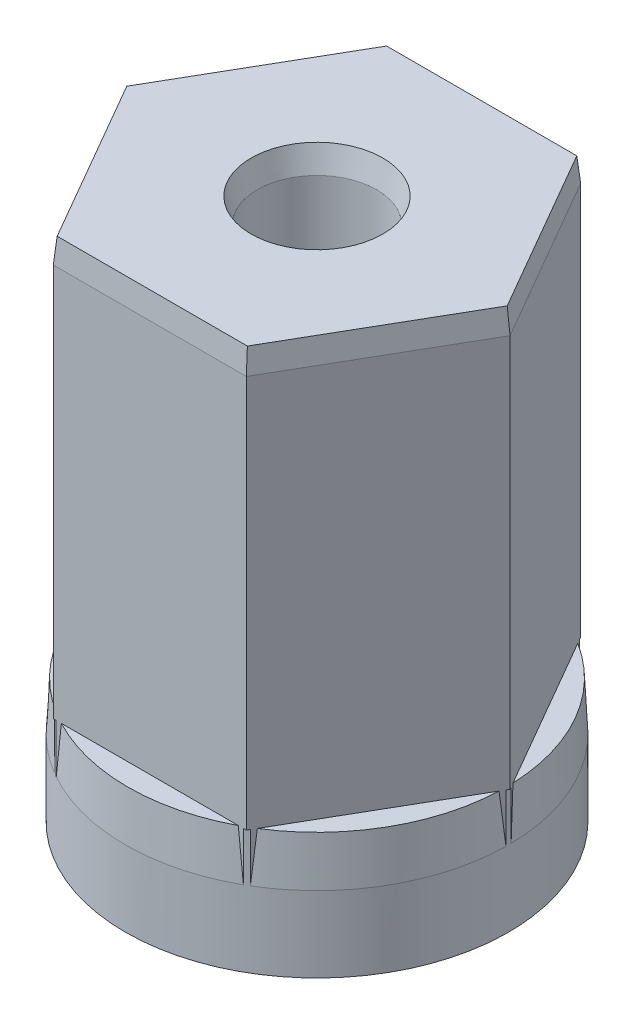
ISO-10303-21;
HEADER;
FILE_DESCRIPTION(('STEP AP214'),'2;1');
FILE_NAME('part.step','',(''),(''),'','','');
FILE_SCHEMA(('AUTOMOTIVE_DESIGN { 1 0 10303 214 1 1 1 1 }'));
ENDSEC;
DATA;
#1=APPLICATION_CONTEXT('core data for automotive mechanical design processes');
#2=APPLICATION_PROTOCOL_DEFINITION('international standard','automotive_design',2000,#1);
#3=PRODUCT_CONTEXT('',#1,'mechanical');
#4=PRODUCT('Part','Part','',(#3));
#5=PRODUCT_RELATED_PRODUCT_CATEGORY('part','',(#4));
#6=PRODUCT_DEFINITION_FORMATION('','',#4);
#7=PRODUCT_DEFINITION_CONTEXT('part definition',#1,'design');
#8=PRODUCT_DEFINITION('design','',#6,#7);
#9=PRODUCT_DEFINITION_SHAPE('','',#8);
#10=(LENGTH_UNIT() NAMED_UNIT(*) SI_UNIT(.MILLI.,.METRE.));
#11=(NAMED_UNIT(*) PLANE_ANGLE_UNIT() SI_UNIT($,.RADIAN.));
#12=(NAMED_UNIT(*) SI_UNIT($,.STERADIAN.) SOLID_ANGLE_UNIT());
#13=UNCERTAINTY_MEASURE_WITH_UNIT(LENGTH_MEASURE(1.E-05),#10,'distance_accuracy_value','');
#14=(GEOMETRIC_REPRESENTATION_CONTEXT(3) GLOBAL_UNCERTAINTY_ASSIGNED_CONTEXT((#13)) GLOBAL_UNIT_ASSIGNED_CONTEXT((#10,
#11,#12)) REPRESENTATION_CONTEXT('',''));
#15=CARTESIAN_POINT('',(0.,0.,0.));
#16=DIRECTION('',(0.,0.,1.));
#17=DIRECTION('',(1.,0.,0.));
#18=AXIS2_PLACEMENT_3D('',#15,#16,#17);
#19=CARTESIAN_POINT('',(0.,0.,0.));
#20=DIRECTION('',(0.,1.,0.));
#21=DIRECTION('',(0.,0.,1.));
#22=AXIS2_PLACEMENT_3D('',#19,#20,#21);
#23=PLANE('',#22);
#24=CARTESIAN_POINT('',(0.,0.,0.));
#25=DIRECTION('',(0.,1.,0.));
#26=DIRECTION('',(0.,0.,1.));
#27=AXIS2_PLACEMENT_3D('',#24,#25,#26);
#28=CIRCLE('',#27,7.85);
#29=CARTESIAN_POINT('',(0.,0.,7.85));
#30=VERTEX_POINT('',#29);
#31=EDGE_CURVE('E226',#30,#30,#28,.T.);
#32=ORIENTED_EDGE('',*,*,#31,.F.);
#33=EDGE_LOOP('',(#32));
#34=FACE_BOUND('',#33,.T.);
#35=CARTESIAN_POINT('',(0.,0.,0.));
#36=DIRECTION('',(0.,1.,0.));
#37=DIRECTION('',(0.,0.,1.));
#38=AXIS2_PLACEMENT_3D('',#35,#36,#37);
#39=CIRCLE('',#38,3.95);
#40=CARTESIAN_POINT('',(0.,0.,3.95));
#41=VERTEX_POINT('',#40);
#42=EDGE_CURVE('E490',#41,#41,#39,.F.);
#43=ORIENTED_EDGE('',*,*,#42,.F.);
#44=EDGE_LOOP('',(#43));
#45=FACE_BOUND('',#44,.T.);
#46=ADVANCED_FACE('F35',(#34,#45),#23,.F.);
#47=CARTESIAN_POINT('',(0.,5.1,0.));
#48=DIRECTION('',(0.,1.,0.));
#49=DIRECTION('',(0.,0.,1.));
#50=AXIS2_PLACEMENT_3D('',#47,#48,#49);
#51=PLANE('',#50);
#52=DIRECTION('',(1.,0.,0.));
#53=VECTOR('',#52,1.);
#54=CARTESIAN_POINT('',(-3.95484934394894,5.1,6.85));
#55=LINE('',#54,#53);
#56=CARTESIAN_POINT('',(-3.62491379207834,5.1,6.85));
#57=VERTEX_POINT('',#56);
#58=CARTESIAN_POINT('',(3.62491379207834,5.1,6.85));
#59=VERTEX_POINT('',#58);
#60=EDGE_CURVE('E240',#57,#59,#55,.T.);
#61=ORIENTED_EDGE('',*,*,#60,.F.);
#62=CARTESIAN_POINT('',(0.,5.1,0.));
#63=DIRECTION('',(0.,1.,0.));
#64=DIRECTION('',(0.,0.,1.));
#65=AXIS2_PLACEMENT_3D('',#62,#63,#64);
#66=CIRCLE('',#65,7.74999999999999);
#67=EDGE_CURVE('E333',#57,#59,#66,.T.);
#68=ORIENTED_EDGE('',*,*,#67,.T.);
#69=EDGE_LOOP('',(#61,#68));
#70=FACE_BOUND('',#69,.T.);
#71=ADVANCED_FACE('F478',(#70),#51,.T.);
#72=DIRECTION('',(0.5,0.,0.866025403784439));
#73=VECTOR('',#72,1.);
#74=CARTESIAN_POINT('',(-7.90969868789788,5.1,0.));
#75=LINE('',#74,#73);
#76=CARTESIAN_POINT('',(-7.74473091196268,5.1,0.285732569531405));
#77=VERTEX_POINT('',#76);
#78=CARTESIAN_POINT('',(-4.11981711988414,5.1,6.5642674304686));
#79=VERTEX_POINT('',#78);
#80=EDGE_CURVE('E572',#77,#79,#75,.T.);
#81=ORIENTED_EDGE('',*,*,#80,.F.);
#82=CARTESIAN_POINT('',(0.,5.1,0.));
#83=DIRECTION('',(0.,1.,0.));
#84=DIRECTION('',(0.,0.,1.));
#85=AXIS2_PLACEMENT_3D('',#82,#83,#84);
#86=CIRCLE('',#85,7.75000000000008);
#87=EDGE_CURVE('E336',#77,#79,#86,.T.);
#88=ORIENTED_EDGE('',*,*,#87,.T.);
#89=EDGE_LOOP('',(#81,#88));
#90=FACE_BOUND('',#89,.T.);
#91=ADVANCED_FACE('F485',(#90),#51,.T.);
#92=DIRECTION('',(-0.5,0.,0.866025403784439));
#93=VECTOR('',#92,1.);
#94=CARTESIAN_POINT('',(-3.95484934394894,5.1,-6.85));
#95=LINE('',#94,#93);
#96=CARTESIAN_POINT('',(-4.11981711988418,5.1,-6.56426743046852));
#97=VERTEX_POINT('',#96);
#98=CARTESIAN_POINT('',(-7.74473091196263,5.1,-0.285732569531482));
#99=VERTEX_POINT('',#98);
#100=EDGE_CURVE('E575',#97,#99,#95,.T.);
#101=ORIENTED_EDGE('',*,*,#100,.F.);
#102=CARTESIAN_POINT('',(0.,5.1,0.));
#103=DIRECTION('',(0.,1.,0.));
#104=DIRECTION('',(0.,0.,1.));
#105=AXIS2_PLACEMENT_3D('',#102,#103,#104);
#106=CIRCLE('',#105,7.75000000000004);
#107=EDGE_CURVE('E275',#97,#99,#106,.T.);
#108=ORIENTED_EDGE('',*,*,#107,.T.);
#109=EDGE_LOOP('',(#101,#108));
#110=FACE_BOUND('',#109,.T.);
#111=ADVANCED_FACE('F789',(#110),#51,.T.);
#112=DIRECTION('',(-1.,0.,0.));
#113=VECTOR('',#112,1.);
#114=CARTESIAN_POINT('',(3.95484934394894,5.1,-6.85));
#115=LINE('',#114,#113);
#116=CARTESIAN_POINT('',(3.62491379207834,5.1,-6.85));
#117=VERTEX_POINT('',#116);
#118=CARTESIAN_POINT('',(-3.62491379207834,5.1,-6.85));
#119=VERTEX_POINT('',#118);
#120=EDGE_CURVE('E255',#117,#119,#115,.T.);
#121=ORIENTED_EDGE('',*,*,#120,.F.);
#122=CARTESIAN_POINT('',(0.,5.1,0.));
#123=DIRECTION('',(0.,1.,0.));
#124=DIRECTION('',(0.,0.,1.));
#125=AXIS2_PLACEMENT_3D('',#122,#123,#124);
#126=CIRCLE('',#125,7.74999999999999);
#127=EDGE_CURVE('E324',#117,#119,#126,.T.);
#128=ORIENTED_EDGE('',*,*,#127,.T.);
#129=EDGE_LOOP('',(#121,#128));
#130=FACE_BOUND('',#129,.T.);
#131=ADVANCED_FACE('F782',(#130),#51,.T.);
#132=DIRECTION('',(-0.5,0.,-0.866025403784438));
#133=VECTOR('',#132,1.);
#134=CARTESIAN_POINT('',(7.90969868789788,5.1,0.));
#135=LINE('',#134,#133);
#136=CARTESIAN_POINT('',(7.74473091196273,5.1,-0.285732569531317));
#137=VERTEX_POINT('',#136);
#138=CARTESIAN_POINT('',(4.11981711988408,5.1,-6.56426743046869));
#139=VERTEX_POINT('',#138);
#140=EDGE_CURVE('E250',#137,#139,#135,.T.);
#141=ORIENTED_EDGE('',*,*,#140,.F.);
#142=CARTESIAN_POINT('',(0.,5.1,0.));
#143=DIRECTION('',(0.,1.,0.));
#144=DIRECTION('',(0.,0.,1.));
#145=AXIS2_PLACEMENT_3D('',#142,#143,#144);
#146=CIRCLE('',#145,7.75000000000013);
#147=EDGE_CURVE('E327',#137,#139,#146,.T.);
#148=ORIENTED_EDGE('',*,*,#147,.T.);
#149=EDGE_LOOP('',(#141,#148));
#150=FACE_BOUND('',#149,.T.);
#151=ADVANCED_FACE('F479',(#150),#51,.T.);
#152=CARTESIAN_POINT('',(0.,5.1,0.));
#153=DIRECTION('',(0.,-1.,0.));
#154=DIRECTION('',(0.,0.,-1.));
#155=AXIS2_PLACEMENT_3D('',#152,#153,#154);
#156=CYLINDRICAL_SURFACE('',#155,7.85);
#157=CARTESIAN_POINT('',(0.,5.1,0.));
#158=DIRECTION('',(0.,1.,0.));
#159=DIRECTION('',(0.,0.,1.));
#160=AXIS2_PLACEMENT_3D('',#157,#158,#159);
#161=CIRCLE('',#160,7.85);
#162=CARTESIAN_POINT('',(-7.84930296719149,5.1,-0.104608456823206));
#163=VERTEX_POINT('',#162);
#164=CARTESIAN_POINT('',(-7.84930296719149,5.1,0.104608456823207));
#165=VERTEX_POINT('',#164);
#166=EDGE_CURVE('E263',#163,#165,#161,.T.);
#167=ORIENTED_EDGE('',*,*,#166,.F.);
#168=DIRECTION('',(0.,-1.,0.));
#169=VECTOR('',#168,1.);
#170=CARTESIAN_POINT('',(-7.84930296719149,5.1,-0.104608456823206));
#171=LINE('',#170,#169);
#172=CARTESIAN_POINT('',(-7.84930296719149,3.1000000000006,-0.104608456823208));
#173=VERTEX_POINT('',#172);
#174=EDGE_CURVE('E321',#163,#173,#171,.T.);
#175=ORIENTED_EDGE('',*,*,#174,.T.);
#176=CARTESIAN_POINT('',(0.,3.1000000000006,0.));
#177=DIRECTION('',(0.,1.,0.));
#178=DIRECTION('',(0.,0.,1.));
#179=AXIS2_PLACEMENT_3D('',#176,#177,#178);
#180=CIRCLE('',#179,7.85);
#181=CARTESIAN_POINT('',(-4.01524506465533,3.1000000000006,-6.74539154317679));
#182=VERTEX_POINT('',#181);
#183=EDGE_CURVE('E318',#173,#182,#180,.F.);
#184=ORIENTED_EDGE('',*,*,#183,.T.);
#185=DIRECTION('',(0.,-1.,0.));
#186=VECTOR('',#185,1.);
#187=CARTESIAN_POINT('',(-4.01524506465533,3.1000000000006,-6.74539154317679));
#188=LINE('',#187,#186);
#189=CARTESIAN_POINT('',(-4.01524506465533,5.1,-6.7453915431768));
#190=VERTEX_POINT('',#189);
#191=EDGE_CURVE('E316',#182,#190,#188,.F.);
#192=ORIENTED_EDGE('',*,*,#191,.T.);
#193=CARTESIAN_POINT('',(-3.83405790253616,5.1,-6.85));
#194=VERTEX_POINT('',#193);
#195=EDGE_CURVE('E270',#194,#190,#161,.T.);
#196=ORIENTED_EDGE('',*,*,#195,.F.);
#197=DIRECTION('',(0.,-1.,0.));
#198=VECTOR('',#197,1.);
#199=CARTESIAN_POINT('',(-3.83405790253616,5.1,-6.85));
#200=LINE('',#199,#198);
#201=CARTESIAN_POINT('',(-3.83405790253616,3.09999999999966,-6.85));
#202=VERTEX_POINT('',#201);
#203=EDGE_CURVE('E313',#194,#202,#200,.T.);
#204=ORIENTED_EDGE('',*,*,#203,.T.);
#205=CARTESIAN_POINT('',(0.,3.09999999999966,0.));
#206=DIRECTION('',(0.,1.,0.));
#207=DIRECTION('',(0.,0.,1.));
#208=AXIS2_PLACEMENT_3D('',#205,#206,#207);
#209=CIRCLE('',#208,7.85);
#210=CARTESIAN_POINT('',(3.83405790253616,3.09999999999966,-6.85));
#211=VERTEX_POINT('',#210);
#212=EDGE_CURVE('E310',#202,#211,#209,.F.);
#213=ORIENTED_EDGE('',*,*,#212,.T.);
#214=DIRECTION('',(0.,-1.,0.));
#215=VECTOR('',#214,1.);
#216=CARTESIAN_POINT('',(3.83405790253616,3.09999999999966,-6.85));
#217=LINE('',#216,#215);
#218=CARTESIAN_POINT('',(3.83405790253616,5.1,-6.85));
#219=VERTEX_POINT('',#218);
#220=EDGE_CURVE('E308',#211,#219,#217,.F.);
#221=ORIENTED_EDGE('',*,*,#220,.T.);
#222=CARTESIAN_POINT('',(4.01524506465533,5.1,-6.7453915431768));
#223=VERTEX_POINT('',#222);
#224=EDGE_CURVE('E260',#223,#219,#161,.T.);
#225=ORIENTED_EDGE('',*,*,#224,.F.);
#226=DIRECTION('',(0.,-1.,0.));
#227=VECTOR('',#226,1.);
#228=CARTESIAN_POINT('',(4.01524506465533,5.1,-6.7453915431768));
#229=LINE('',#228,#227);
#230=CARTESIAN_POINT('',(4.01524506465533,3.10000000000243,-6.74539154317679));
#231=VERTEX_POINT('',#230);
#232=EDGE_CURVE('E305',#223,#231,#229,.T.);
#233=ORIENTED_EDGE('',*,*,#232,.T.);
#234=CARTESIAN_POINT('',(0.,3.10000000000243,0.));
#235=DIRECTION('',(0.,1.,0.));
#236=DIRECTION('',(0.,0.,1.));
#237=AXIS2_PLACEMENT_3D('',#234,#235,#236);
#238=CIRCLE('',#237,7.85);
#239=CARTESIAN_POINT('',(7.84930296719149,3.10000000000243,-0.104608456823211));
#240=VERTEX_POINT('',#239);
#241=EDGE_CURVE('E302',#231,#240,#238,.F.);
#242=ORIENTED_EDGE('',*,*,#241,.T.);
#243=DIRECTION('',(0.,-1.,0.));
#244=VECTOR('',#243,1.);
#245=CARTESIAN_POINT('',(7.84930296719149,3.10000000000243,-0.104608456823211));
#246=LINE('',#245,#244);
#247=CARTESIAN_POINT('',(7.84930296719149,5.1,-0.104608456823211));
#248=VERTEX_POINT('',#247);
#249=EDGE_CURVE('E300',#240,#248,#246,.F.);
#250=ORIENTED_EDGE('',*,*,#249,.T.);
#251=CARTESIAN_POINT('',(7.84930296719149,5.1,0.104608456823209));
#252=VERTEX_POINT('',#251);
#253=EDGE_CURVE('E256',#252,#248,#161,.T.);
#254=ORIENTED_EDGE('',*,*,#253,.F.);
#255=DIRECTION('',(0.,-1.,0.));
#256=VECTOR('',#255,1.);
#257=CARTESIAN_POINT('',(7.84930296719149,5.1,0.104608456823209));
#258=LINE('',#257,#256);
#259=CARTESIAN_POINT('',(7.84930296719149,3.10000000000243,0.104608456823209));
#260=VERTEX_POINT('',#259);
#261=EDGE_CURVE('E297',#252,#260,#258,.T.);
#262=ORIENTED_EDGE('',*,*,#261,.T.);
#263=CARTESIAN_POINT('',(0.,3.10000000000243,0.));
#264=DIRECTION('',(0.,1.,0.));
#265=DIRECTION('',(0.,0.,1.));
#266=AXIS2_PLACEMENT_3D('',#263,#264,#265);
#267=CIRCLE('',#266,7.85);
#268=CARTESIAN_POINT('',(4.01524506465533,3.10000000000243,6.74539154317679));
#269=VERTEX_POINT('',#268);
#270=EDGE_CURVE('E294',#260,#269,#267,.F.);
#271=ORIENTED_EDGE('',*,*,#270,.T.);
#272=DIRECTION('',(0.,-1.,0.));
#273=VECTOR('',#272,1.);
#274=CARTESIAN_POINT('',(4.01524506465533,3.10000000000243,6.74539154317679));
#275=LINE('',#274,#273);
#276=CARTESIAN_POINT('',(4.01524506465533,5.1,6.74539154317679));
#277=VERTEX_POINT('',#276);
#278=EDGE_CURVE('E292',#269,#277,#275,.F.);
#279=ORIENTED_EDGE('',*,*,#278,.T.);
#280=CARTESIAN_POINT('',(3.83405790253616,5.1,6.85));
#281=VERTEX_POINT('',#280);
#282=EDGE_CURVE('E242',#281,#277,#161,.T.);
#283=ORIENTED_EDGE('',*,*,#282,.F.);
#284=DIRECTION('',(0.,-1.,0.));
#285=VECTOR('',#284,1.);
#286=CARTESIAN_POINT('',(3.83405790253616,5.1,6.85));
#287=LINE('',#286,#285);
#288=CARTESIAN_POINT('',(3.83405790253616,3.09999999999966,6.85));
#289=VERTEX_POINT('',#288);
#290=EDGE_CURVE('E233',#281,#289,#287,.T.);
#291=ORIENTED_EDGE('',*,*,#290,.T.);
#292=CARTESIAN_POINT('',(0.,3.09999999999966,0.));
#293=DIRECTION('',(0.,1.,0.));
#294=DIRECTION('',(0.,0.,1.));
#295=AXIS2_PLACEMENT_3D('',#292,#293,#294);
#296=CIRCLE('',#295,7.85);
#297=CARTESIAN_POINT('',(-3.83405790253616,3.09999999999966,6.85));
#298=VERTEX_POINT('',#297);
#299=EDGE_CURVE('E288',#289,#298,#296,.F.);
#300=ORIENTED_EDGE('',*,*,#299,.T.);
#301=DIRECTION('',(0.,-1.,0.));
#302=VECTOR('',#301,1.);
#303=CARTESIAN_POINT('',(-3.83405790253616,3.09999999999966,6.85));
#304=LINE('',#303,#302);
#305=CARTESIAN_POINT('',(-3.83405790253616,5.1,6.85));
#306=VERTEX_POINT('',#305);
#307=EDGE_CURVE('E286',#298,#306,#304,.F.);
#308=ORIENTED_EDGE('',*,*,#307,.T.);
#309=CARTESIAN_POINT('',(-4.01524506465533,5.1,6.7453915431768));
#310=VERTEX_POINT('',#309);
#311=EDGE_CURVE('E258',#310,#306,#161,.T.);
#312=ORIENTED_EDGE('',*,*,#311,.F.);
#313=DIRECTION('',(0.,-1.,0.));
#314=VECTOR('',#313,1.);
#315=CARTESIAN_POINT('',(-4.01524506465533,5.1,6.7453915431768));
#316=LINE('',#315,#314);
#317=CARTESIAN_POINT('',(-4.01524506465532,3.10000000000146,6.7453915431768));
#318=VERTEX_POINT('',#317);
#319=EDGE_CURVE('E283',#310,#318,#316,.T.);
#320=ORIENTED_EDGE('',*,*,#319,.T.);
#321=CARTESIAN_POINT('',(0.,3.10000000000146,0.));
#322=DIRECTION('',(0.,1.,0.));
#323=DIRECTION('',(0.,0.,1.));
#324=AXIS2_PLACEMENT_3D('',#321,#322,#323);
#325=CIRCLE('',#324,7.85);
#326=CARTESIAN_POINT('',(-7.84930296719149,3.10000000000146,0.104608456823207));
#327=VERTEX_POINT('',#326);
#328=EDGE_CURVE('E280',#318,#327,#325,.F.);
#329=ORIENTED_EDGE('',*,*,#328,.T.);
#330=DIRECTION('',(0.,-1.,0.));
#331=VECTOR('',#330,1.);
#332=CARTESIAN_POINT('',(-7.84930296719149,3.10000000000146,0.104608456823207));
#333=LINE('',#332,#331);
#334=EDGE_CURVE('E278',#327,#165,#333,.F.);
#335=ORIENTED_EDGE('',*,*,#334,.T.);
#336=EDGE_LOOP('',(#167,#175,#184,#192,#196,#204,#213,#221,#225,#233,#242,#250,#254,#262,#271,
#279,#283,#291,#300,#308,#312,#320,#329,#335));
#337=FACE_BOUND('',#336,.T.);
#338=ORIENTED_EDGE('',*,*,#31,.T.);
#339=EDGE_LOOP('',(#338));
#340=FACE_BOUND('',#339,.T.);
#341=ADVANCED_FACE('F369',(#337,#340),#156,.T.);
#342=DIRECTION('',(0.5,0.,-0.866025403784439));
#343=VECTOR('',#342,1.);
#344=CARTESIAN_POINT('',(3.95484934394894,5.1,6.85));
#345=LINE('',#344,#343);
#346=CARTESIAN_POINT('',(4.11981711988409,5.1,6.56426743046869));
#347=VERTEX_POINT('',#346);
#348=CARTESIAN_POINT('',(7.74473091196273,5.1,0.285732569531315));
#349=VERTEX_POINT('',#348);
#350=EDGE_CURVE('E246',#347,#349,#345,.T.);
#351=ORIENTED_EDGE('',*,*,#350,.F.);
#352=CARTESIAN_POINT('',(0.,5.1,0.));
#353=DIRECTION('',(0.,1.,0.));
#354=DIRECTION('',(0.,0.,1.));
#355=AXIS2_PLACEMENT_3D('',#352,#353,#354);
#356=CIRCLE('',#355,7.75000000000013);
#357=EDGE_CURVE('E330',#347,#349,#356,.T.);
#358=ORIENTED_EDGE('',*,*,#357,.T.);
#359=EDGE_LOOP('',(#351,#358));
#360=FACE_BOUND('',#359,.T.);
#361=ADVANCED_FACE('F474',(#360),#51,.T.);
#362=CARTESIAN_POINT('',(0.,5.1,0.));
#363=DIRECTION('',(0.,1.,0.));
#364=DIRECTION('',(0.,0.,1.));
#365=AXIS2_PLACEMENT_3D('',#362,#363,#364);
#366=PLANE('',#365);
#367=CARTESIAN_POINT('',(3.95484934394894,5.1,6.85));
#368=VERTEX_POINT('',#367);
#369=EDGE_CURVE('E230',#281,#368,#55,.T.);
#370=ORIENTED_EDGE('',*,*,#369,.F.);
#371=ORIENTED_EDGE('',*,*,#282,.T.);
#372=EDGE_CURVE('E220',#368,#277,#345,.T.);
#373=ORIENTED_EDGE('',*,*,#372,.F.);
#374=EDGE_LOOP('',(#370,#371,#373));
#375=FACE_BOUND('',#374,.T.);
#376=ADVANCED_FACE('F241',(#375),#366,.F.);
#377=CARTESIAN_POINT('',(7.90969868789788,5.1,0.));
#378=VERTEX_POINT('',#377);
#379=EDGE_CURVE('E244',#252,#378,#345,.T.);
#380=ORIENTED_EDGE('',*,*,#379,.F.);
#381=ORIENTED_EDGE('',*,*,#253,.T.);
#382=EDGE_CURVE('E248',#378,#248,#135,.T.);
#383=ORIENTED_EDGE('',*,*,#382,.F.);
#384=EDGE_LOOP('',(#380,#381,#383));
#385=FACE_BOUND('',#384,.T.);
#386=ADVANCED_FACE('F546',(#385),#366,.F.);
#387=CARTESIAN_POINT('',(3.95484934394894,5.1,-6.85));
#388=VERTEX_POINT('',#387);
#389=EDGE_CURVE('E243',#223,#388,#135,.T.);
#390=ORIENTED_EDGE('',*,*,#389,.F.);
#391=ORIENTED_EDGE('',*,*,#224,.T.);
#392=EDGE_CURVE('E605',#388,#219,#115,.T.);
#393=ORIENTED_EDGE('',*,*,#392,.F.);
#394=EDGE_LOOP('',(#390,#391,#393));
#395=FACE_BOUND('',#394,.T.);
#396=ADVANCED_FACE('F752',(#395),#366,.F.);
#397=CARTESIAN_POINT('',(-3.95484934394894,5.1,-6.85));
#398=VERTEX_POINT('',#397);
#399=EDGE_CURVE('E603',#194,#398,#115,.T.);
#400=ORIENTED_EDGE('',*,*,#399,.F.);
#401=ORIENTED_EDGE('',*,*,#195,.T.);
#402=EDGE_CURVE('E583',#398,#190,#95,.T.);
#403=ORIENTED_EDGE('',*,*,#402,.F.);
#404=EDGE_LOOP('',(#400,#401,#403));
#405=FACE_BOUND('',#404,.T.);
#406=ADVANCED_FACE('F746',(#405),#366,.F.);
#407=CARTESIAN_POINT('',(-7.90969868789788,5.1,0.));
#408=VERTEX_POINT('',#407);
#409=EDGE_CURVE('E582',#163,#408,#95,.T.);
#410=ORIENTED_EDGE('',*,*,#409,.F.);
#411=ORIENTED_EDGE('',*,*,#166,.T.);
#412=EDGE_CURVE('E578',#408,#165,#75,.T.);
#413=ORIENTED_EDGE('',*,*,#412,.F.);
#414=EDGE_LOOP('',(#410,#411,#413));
#415=FACE_BOUND('',#414,.T.);
#416=ADVANCED_FACE('F617',(#415),#366,.F.);
#417=CARTESIAN_POINT('',(-3.95484934394894,5.1,6.85));
#418=VERTEX_POINT('',#417);
#419=EDGE_CURVE('E577',#310,#418,#75,.T.);
#420=ORIENTED_EDGE('',*,*,#419,.F.);
#421=ORIENTED_EDGE('',*,*,#311,.T.);
#422=EDGE_CURVE('E237',#418,#306,#55,.T.);
#423=ORIENTED_EDGE('',*,*,#422,.F.);
#424=EDGE_LOOP('',(#420,#421,#423));
#425=FACE_BOUND('',#424,.T.);
#426=ADVANCED_FACE('F541',(#425),#366,.F.);
#427=CARTESIAN_POINT('',(-7.90969868789788,44.1270956736317,0.));
#428=DIRECTION('',(0.866025403784439,0.,-0.5));
#429=DIRECTION('',(-0.5,0.,-0.866025403784439));
#430=AXIS2_PLACEMENT_3D('',#427,#428,#429);
#431=PLANE('',#430);
#432=DIRECTION('',(0.,-1.,0.));
#433=VECTOR('',#432,1.);
#434=CARTESIAN_POINT('',(-3.95484934394894,44.1270956736317,6.85));
#435=LINE('',#434,#433);
#436=CARTESIAN_POINT('',(-3.95484934394894,21.2,6.85));
#437=VERTEX_POINT('',#436);
#438=EDGE_CURVE('E587',#437,#418,#435,.T.);
#439=ORIENTED_EDGE('',*,*,#438,.F.);
#440=DIRECTION('',(-0.5,0.,-0.866025403784439));
#441=VECTOR('',#440,1.);
#442=CARTESIAN_POINT('',(-7.90969868789788,21.2,0.));
#443=LINE('',#442,#441);
#444=CARTESIAN_POINT('',(-7.90969868789788,21.2,0.));
#445=VERTEX_POINT('',#444);
#446=EDGE_CURVE('E516',#437,#445,#443,.T.);
#447=ORIENTED_EDGE('',*,*,#446,.T.);
#448=DIRECTION('',(0.,-1.,0.));
#449=VECTOR('',#448,1.);
#450=CARTESIAN_POINT('',(-7.90969868789788,44.1270956736317,0.));
#451=LINE('',#450,#449);
#452=EDGE_CURVE('E589',#445,#408,#451,.T.);
#453=ORIENTED_EDGE('',*,*,#452,.T.);
#454=ORIENTED_EDGE('',*,*,#412,.T.);
#455=ORIENTED_EDGE('',*,*,#334,.F.);
#456=CARTESIAN_POINT('',(-7.84930296719149,3.10000000000146,0.104608456823207));
#457=CARTESIAN_POINT('',(-7.83224712355649,3.43341130629915,0.134150044564967));
#458=CARTESIAN_POINT('',(-7.81500486387464,3.76678362477855,0.164014514371224));
#459=CARTESIAN_POINT('',(-7.78014751213776,4.43345029144599,0.224389218596808));
#460=CARTESIAN_POINT('',(-7.76253242007674,4.76674463963279,0.254899453026492));
#461=CARTESIAN_POINT('',(-7.74473091196289,5.10000000000004,0.285732569531028));
#462=B_SPLINE_CURVE_WITH_KNOTS('',3,(#456,#457,#458,#459,#460,#461),.UNSPECIFIED.,.F.,.F.,(4,2,
4),(0.,1.00545341176837,2.01090683965989),.UNSPECIFIED.);
#463=EDGE_CURVE('E532',#327,#77,#462,.T.);
#464=ORIENTED_EDGE('',*,*,#463,.T.);
#465=ORIENTED_EDGE('',*,*,#80,.T.);
#466=CARTESIAN_POINT('',(-4.11981711988413,5.1,6.5642674304686));
#467=CARTESIAN_POINT('',(-4.10201561177021,4.76674463963276,6.59510054697326));
#468=CARTESIAN_POINT('',(-4.08440051970912,4.43345029144598,6.62561078140307));
#469=CARTESIAN_POINT('',(-4.0495431679721,3.76678362477856,6.6859854856289));
#470=CARTESIAN_POINT('',(-4.03230090829018,3.43341130629918,6.71584995543528));
#471=CARTESIAN_POINT('',(-4.01524506465512,3.10000000000151,6.74539154317716));
#472=B_SPLINE_CURVE_WITH_KNOTS('',3,(#466,#467,#468,#469,#470,#471),.UNSPECIFIED.,.F.,.F.,(4,2,
4),(0.,1.00545342789152,2.01090683965989),.UNSPECIFIED.);
#473=EDGE_CURVE('E465',#79,#318,#472,.T.);
#474=ORIENTED_EDGE('',*,*,#473,.T.);
#475=ORIENTED_EDGE('',*,*,#319,.F.);
#476=ORIENTED_EDGE('',*,*,#419,.T.);
#477=EDGE_LOOP('',(#439,#447,#453,#454,#455,#464,#465,#474,#475,#476));
#478=FACE_BOUND('',#477,.T.);
#479=ADVANCED_FACE('F537',(#478),#431,.F.);
#480=CARTESIAN_POINT('',(-3.95484934394894,44.1270956736317,-6.85));
#481=DIRECTION('',(0.866025403784439,0.,0.5));
#482=DIRECTION('',(0.5,0.,-0.866025403784439));
#483=AXIS2_PLACEMENT_3D('',#480,#481,#482);
#484=PLANE('',#483);
#485=ORIENTED_EDGE('',*,*,#452,.F.);
#486=DIRECTION('',(0.5,0.,-0.866025403784439));
#487=VECTOR('',#486,1.);
#488=CARTESIAN_POINT('',(-3.95484934394894,21.2,-6.85));
#489=LINE('',#488,#487);
#490=CARTESIAN_POINT('',(-3.95484934394894,21.2,-6.85));
#491=VERTEX_POINT('',#490);
#492=EDGE_CURVE('E514',#445,#491,#489,.T.);
#493=ORIENTED_EDGE('',*,*,#492,.T.);
#494=DIRECTION('',(0.,-1.,0.));
#495=VECTOR('',#494,1.);
#496=CARTESIAN_POINT('',(-3.95484934394894,44.1270956736317,-6.85));
#497=LINE('',#496,#495);
#498=EDGE_CURVE('E591',#491,#398,#497,.T.);
#499=ORIENTED_EDGE('',*,*,#498,.T.);
#500=ORIENTED_EDGE('',*,*,#402,.T.);
#501=ORIENTED_EDGE('',*,*,#191,.F.);
#502=CARTESIAN_POINT('',(-4.01524506465533,3.1000000000006,-6.74539154317679));
#503=CARTESIAN_POINT('',(-4.03230090829033,3.43341130629843,-6.71584995543502));
#504=CARTESIAN_POINT('',(-4.04954316797218,3.76678362477797,-6.68598548562875));
#505=CARTESIAN_POINT('',(-4.08440051970908,4.4334502914457,-6.62561078140314));
#506=CARTESIAN_POINT('',(-4.10201561177011,4.76674463963264,-6.59510054697345));
#507=CARTESIAN_POINT('',(-4.11981711988397,5.10000000000004,-6.5642674304689));
#508=B_SPLINE_CURVE_WITH_KNOTS('',3,(#502,#503,#504,#505,#506,#507),.UNSPECIFIED.,.F.,.F.,(4,2,
4),(0.,1.0054534117688,2.01090683966076),.UNSPECIFIED.);
#509=EDGE_CURVE('E347',#182,#97,#508,.T.);
#510=ORIENTED_EDGE('',*,*,#509,.T.);
#511=ORIENTED_EDGE('',*,*,#100,.T.);
#512=CARTESIAN_POINT('',(-7.74473091196263,5.1,-0.285732569531483));
#513=CARTESIAN_POINT('',(-7.76253242007656,4.76674463963261,-0.254899453026806));
#514=CARTESIAN_POINT('',(-7.78014751213766,4.43345029144569,-0.224389218596984));
#515=CARTESIAN_POINT('',(-7.8150048638747,3.76678362477799,-0.164014514371125));
#516=CARTESIAN_POINT('',(-7.83224712355663,3.43341130629846,-0.134150044564733));
#517=CARTESIAN_POINT('',(-7.8493029671917,3.10000000000065,-0.104608456822841));
#518=B_SPLINE_CURVE_WITH_KNOTS('',3,(#512,#513,#514,#515,#516,#517),.UNSPECIFIED.,.F.,.F.,(4,2,
4),(0.,1.00545342789196,2.01090683966076),.UNSPECIFIED.);
#519=EDGE_CURVE('E339',#99,#173,#518,.T.);
#520=ORIENTED_EDGE('',*,*,#519,.T.);
#521=ORIENTED_EDGE('',*,*,#174,.F.);
#522=ORIENTED_EDGE('',*,*,#409,.T.);
#523=EDGE_LOOP('',(#485,#493,#499,#500,#501,#510,#511,#520,#521,#522));
#524=FACE_BOUND('',#523,.T.);
#525=ADVANCED_FACE('F353',(#524),#484,.F.);
#526=CARTESIAN_POINT('',(3.95484934394894,44.1270956736317,-6.85));
#527=DIRECTION('',(0.,0.,1.));
#528=DIRECTION('',(1.,0.,0.));
#529=AXIS2_PLACEMENT_3D('',#526,#527,#528);
#530=PLANE('',#529);
#531=ORIENTED_EDGE('',*,*,#498,.F.);
#532=DIRECTION('',(1.,0.,0.));
#533=VECTOR('',#532,1.);
#534=CARTESIAN_POINT('',(3.95484934394893,21.2,-6.85));
#535=LINE('',#534,#533);
#536=CARTESIAN_POINT('',(3.95484934394894,21.2,-6.85));
#537=VERTEX_POINT('',#536);
#538=EDGE_CURVE('E59',#491,#537,#535,.T.);
#539=ORIENTED_EDGE('',*,*,#538,.T.);
#540=DIRECTION('',(0.,-1.,0.));
#541=VECTOR('',#540,1.);
#542=CARTESIAN_POINT('',(3.95484934394894,44.1270956736317,-6.85));
#543=LINE('',#542,#541);
#544=EDGE_CURVE('E595',#537,#388,#543,.T.);
#545=ORIENTED_EDGE('',*,*,#544,.T.);
#546=ORIENTED_EDGE('',*,*,#392,.T.);
#547=ORIENTED_EDGE('',*,*,#220,.F.);
#548=CARTESIAN_POINT('',(3.83405790253616,3.09999999999966,-6.85));
#549=CARTESIAN_POINT('',(3.79994621526614,3.43341130629765,-6.85));
#550=CARTESIAN_POINT('',(3.76546169590241,3.76678362477734,-6.85));
#551=CARTESIAN_POINT('',(3.69574699242857,4.43345029144539,-6.85));
#552=CARTESIAN_POINT('',(3.66051680830651,4.76674463963249,-6.85));
#553=CARTESIAN_POINT('',(3.62491379207877,5.10000000000004,-6.85));
#554=B_SPLINE_CURVE_WITH_KNOTS('',3,(#548,#549,#550,#551,#552,#553),.UNSPECIFIED.,.F.,.F.,(4,2,
4),(0.,1.00545341176928,2.01090683966171),.UNSPECIFIED.);
#555=EDGE_CURVE('E389',#211,#117,#554,.T.);
#556=ORIENTED_EDGE('',*,*,#555,.T.);
#557=ORIENTED_EDGE('',*,*,#120,.T.);
#558=CARTESIAN_POINT('',(-3.62491379207834,5.1,-6.85));
#559=CARTESIAN_POINT('',(-3.66051680830622,4.76674463963246,-6.85));
#560=CARTESIAN_POINT('',(-3.69574699242843,4.43345029144538,-6.85));
#561=CARTESIAN_POINT('',(-3.76546169590255,3.76678362477736,-6.85));
#562=CARTESIAN_POINT('',(-3.79994621526642,3.43341130629768,-6.85));
#563=CARTESIAN_POINT('',(-3.83405790253658,3.0999999999997,-6.85));
#564=B_SPLINE_CURVE_WITH_KNOTS('',3,(#558,#559,#560,#561,#562,#563),.UNSPECIFIED.,.F.,.F.,(4,2,
4),(0.,1.00545342789243,2.01090683966171),.UNSPECIFIED.);
#565=EDGE_CURVE('E383',#119,#202,#564,.T.);
#566=ORIENTED_EDGE('',*,*,#565,.T.);
#567=ORIENTED_EDGE('',*,*,#203,.F.);
#568=ORIENTED_EDGE('',*,*,#399,.T.);
#569=EDGE_LOOP('',(#531,#539,#545,#546,#547,#556,#557,#566,#567,#568));
#570=FACE_BOUND('',#569,.T.);
#571=ADVANCED_FACE('F402',(#570),#530,.F.);
#572=CARTESIAN_POINT('',(7.90969868789788,44.1270956736317,0.));
#573=DIRECTION('',(-0.866025403784438,0.,0.5));
#574=DIRECTION('',(0.5,0.,0.866025403784439));
#575=AXIS2_PLACEMENT_3D('',#572,#573,#574);
#576=PLANE('',#575);
#577=ORIENTED_EDGE('',*,*,#544,.F.);
#578=DIRECTION('',(0.5,0.,0.866025403784439));
#579=VECTOR('',#578,1.);
#580=CARTESIAN_POINT('',(7.90969868789788,21.2,0.));
#581=LINE('',#580,#579);
#582=CARTESIAN_POINT('',(7.90969868789788,21.2,0.));
#583=VERTEX_POINT('',#582);
#584=EDGE_CURVE('E51',#537,#583,#581,.T.);
#585=ORIENTED_EDGE('',*,*,#584,.T.);
#586=DIRECTION('',(0.,-1.,0.));
#587=VECTOR('',#586,1.);
#588=CARTESIAN_POINT('',(7.90969868789788,44.1270956736317,0.));
#589=LINE('',#588,#587);
#590=EDGE_CURVE('E227',#583,#378,#589,.T.);
#591=ORIENTED_EDGE('',*,*,#590,.T.);
#592=ORIENTED_EDGE('',*,*,#382,.T.);
#593=ORIENTED_EDGE('',*,*,#249,.F.);
#594=CARTESIAN_POINT('',(7.84930296719149,3.10000000000243,-0.104608456823211));
#595=CARTESIAN_POINT('',(7.8322471235565,3.43341130629996,-0.134150044564955));
#596=CARTESIAN_POINT('',(7.81500486387466,3.76678362477919,-0.164014514371198));
#597=CARTESIAN_POINT('',(7.78014751213779,4.43345029144631,-0.224389218596752));
#598=CARTESIAN_POINT('',(7.76253242007679,4.76674463963295,-0.25489945302642));
#599=CARTESIAN_POINT('',(7.74473091196295,5.10000000000004,-0.285732569530941));
#600=B_SPLINE_CURVE_WITH_KNOTS('',3,(#594,#595,#596,#597,#598,#599),.UNSPECIFIED.,.F.,.F.,(4,2,
4),(0.,1.00545341176788,2.01090683965892),.UNSPECIFIED.);
#601=EDGE_CURVE('E413',#240,#137,#600,.T.);
#602=ORIENTED_EDGE('',*,*,#601,.T.);
#603=ORIENTED_EDGE('',*,*,#140,.T.);
#604=CARTESIAN_POINT('',(4.11981711988409,5.1,-6.56426743046869));
#605=CARTESIAN_POINT('',(4.10201561177017,4.76674463963292,-6.59510054697334));
#606=CARTESIAN_POINT('',(4.08440051970909,4.4334502914463,-6.62561078140313));
#607=CARTESIAN_POINT('',(4.04954316797208,3.76678362477921,-6.68598548562893));
#608=CARTESIAN_POINT('',(4.03230090829017,3.43341130629999,-6.7158499554353));
#609=CARTESIAN_POINT('',(4.01524506465511,3.10000000000248,-6.74539154317716));
#610=B_SPLINE_CURVE_WITH_KNOTS('',3,(#604,#605,#606,#607,#608,#609),.UNSPECIFIED.,.F.,.F.,(4,2,
4),(0.,1.00545342789103,2.01090683965892),.UNSPECIFIED.);
#611=EDGE_CURVE('E395',#139,#231,#610,.T.);
#612=ORIENTED_EDGE('',*,*,#611,.T.);
#613=ORIENTED_EDGE('',*,*,#232,.F.);
#614=ORIENTED_EDGE('',*,*,#389,.T.);
#615=EDGE_LOOP('',(#577,#585,#591,#592,#593,#602,#603,#612,#613,#614));
#616=FACE_BOUND('',#615,.T.);
#617=ADVANCED_FACE('F405',(#616),#576,.F.);
#618=CARTESIAN_POINT('',(3.95484934394894,44.1270956736317,6.85));
#619=DIRECTION('',(-0.866025403784439,0.,-0.5));
#620=DIRECTION('',(-0.5,0.,0.866025403784439));
#621=AXIS2_PLACEMENT_3D('',#618,#619,#620);
#622=PLANE('',#621);
#623=ORIENTED_EDGE('',*,*,#590,.F.);
#624=DIRECTION('',(-0.5,0.,0.866025403784439));
#625=VECTOR('',#624,1.);
#626=CARTESIAN_POINT('',(3.95484934394894,21.2,6.85));
#627=LINE('',#626,#625);
#628=CARTESIAN_POINT('',(3.95484934394894,21.2,6.85));
#629=VERTEX_POINT('',#628);
#630=EDGE_CURVE('E222',#583,#629,#627,.T.);
#631=ORIENTED_EDGE('',*,*,#630,.T.);
#632=DIRECTION('',(0.,-1.,0.));
#633=VECTOR('',#632,1.);
#634=CARTESIAN_POINT('',(3.95484934394894,44.1270956736317,6.85));
#635=LINE('',#634,#633);
#636=EDGE_CURVE('E216',#629,#368,#635,.T.);
#637=ORIENTED_EDGE('',*,*,#636,.T.);
#638=ORIENTED_EDGE('',*,*,#372,.T.);
#639=ORIENTED_EDGE('',*,*,#278,.F.);
#640=CARTESIAN_POINT('',(4.01524506465533,3.10000000000243,6.74539154317679));
#641=CARTESIAN_POINT('',(4.03230090829031,3.43341130629996,6.71584995543505));
#642=CARTESIAN_POINT('',(4.04954316797215,3.76678362477919,6.68598548562881));
#643=CARTESIAN_POINT('',(4.08440051970902,4.43345029144631,6.62561078140325));
#644=CARTESIAN_POINT('',(4.10201561177003,4.76674463963295,6.59510054697359));
#645=CARTESIAN_POINT('',(4.11981711988387,5.10000000000004,6.56426743046907));
#646=B_SPLINE_CURVE_WITH_KNOTS('',3,(#640,#641,#642,#643,#644,#645),.UNSPECIFIED.,.F.,.F.,(4,2,
4),(0.,1.00545341176788,2.01090683965892),.UNSPECIFIED.);
#647=EDGE_CURVE('E425',#269,#347,#646,.T.);
#648=ORIENTED_EDGE('',*,*,#647,.T.);
#649=ORIENTED_EDGE('',*,*,#350,.T.);
#650=CARTESIAN_POINT('',(7.74473091196273,5.1,0.285732569531313));
#651=CARTESIAN_POINT('',(7.76253242007664,4.76674463963292,0.254899453026666));
#652=CARTESIAN_POINT('',(7.78014751213772,4.4334502914463,0.224389218596874));
#653=CARTESIAN_POINT('',(7.81500486387473,3.76678362477921,0.164014514371072));
#654=CARTESIAN_POINT('',(7.83224712355664,3.43341130629999,0.134150044564708));
#655=CARTESIAN_POINT('',(7.8493029671917,3.10000000000248,0.104608456822843));
#656=B_SPLINE_CURVE_WITH_KNOTS('',3,(#650,#651,#652,#653,#654,#655),.UNSPECIFIED.,.F.,.F.,(4,2,
4),(0.,1.00545342789103,2.01090683965892),.UNSPECIFIED.);
#657=EDGE_CURVE('E419',#349,#260,#656,.T.);
#658=ORIENTED_EDGE('',*,*,#657,.T.);
#659=ORIENTED_EDGE('',*,*,#261,.F.);
#660=ORIENTED_EDGE('',*,*,#379,.T.);
#661=EDGE_LOOP('',(#623,#631,#637,#638,#639,#648,#649,#658,#659,#660));
#662=FACE_BOUND('',#661,.T.);
#663=ADVANCED_FACE('F218',(#662),#622,.F.);
#664=CARTESIAN_POINT('',(-3.95484934394894,44.1270956736317,6.85));
#665=DIRECTION('',(0.,0.,-1.));
#666=DIRECTION('',(-1.,0.,0.));
#667=AXIS2_PLACEMENT_3D('',#664,#665,#666);
#668=PLANE('',#667);
#669=ORIENTED_EDGE('',*,*,#636,.F.);
#670=DIRECTION('',(-1.,0.,0.));
#671=VECTOR('',#670,1.);
#672=CARTESIAN_POINT('',(-3.95484934394894,21.2,6.85));
#673=LINE('',#672,#671);
#674=EDGE_CURVE('E531',#629,#437,#673,.T.);
#675=ORIENTED_EDGE('',*,*,#674,.T.);
#676=ORIENTED_EDGE('',*,*,#438,.T.);
#677=ORIENTED_EDGE('',*,*,#422,.T.);
#678=ORIENTED_EDGE('',*,*,#307,.F.);
#679=CARTESIAN_POINT('',(-3.83405790253616,3.09999999999966,6.85));
#680=CARTESIAN_POINT('',(-3.79994621526614,3.43341130629765,6.85));
#681=CARTESIAN_POINT('',(-3.76546169590241,3.76678362477734,6.85));
#682=CARTESIAN_POINT('',(-3.69574699242857,4.43345029144539,6.85));
#683=CARTESIAN_POINT('',(-3.66051680830651,4.76674463963249,6.85));
#684=CARTESIAN_POINT('',(-3.62491379207877,5.10000000000004,6.85));
#685=B_SPLINE_CURVE_WITH_KNOTS('',3,(#679,#680,#681,#682,#683,#684),.UNSPECIFIED.,.F.,.F.,(4,2,
4),(0.,1.00545341176928,2.01090683966171),.UNSPECIFIED.);
#686=EDGE_CURVE('E459',#298,#57,#685,.T.);
#687=ORIENTED_EDGE('',*,*,#686,.T.);
#688=ORIENTED_EDGE('',*,*,#60,.T.);
#689=CARTESIAN_POINT('',(3.62491379207834,5.1,6.85));
#690=CARTESIAN_POINT('',(3.66051680830622,4.76674463963246,6.85));
#691=CARTESIAN_POINT('',(3.69574699242843,4.43345029144538,6.85));
#692=CARTESIAN_POINT('',(3.76546169590255,3.76678362477736,6.85));
#693=CARTESIAN_POINT('',(3.79994621526642,3.43341130629768,6.85));
#694=CARTESIAN_POINT('',(3.83405790253658,3.0999999999997,6.85));
#695=B_SPLINE_CURVE_WITH_KNOTS('',3,(#689,#690,#691,#692,#693,#694),.UNSPECIFIED.,.F.,.F.,(4,2,
4),(0.,1.00545342789243,2.01090683966171),.UNSPECIFIED.);
#696=EDGE_CURVE('E453',#59,#289,#695,.T.);
#697=ORIENTED_EDGE('',*,*,#696,.T.);
#698=ORIENTED_EDGE('',*,*,#290,.F.);
#699=ORIENTED_EDGE('',*,*,#369,.T.);
#700=EDGE_LOOP('',(#669,#675,#676,#677,#678,#687,#688,#697,#698,#699));
#701=FACE_BOUND('',#700,.T.);
#702=ADVANCED_FACE('F231',(#701),#668,.F.);
#703=CARTESIAN_POINT('',(-1.34053226703029,22.2,2.11020691901307));
#704=DIRECTION('',(0.,-1.,0.));
#705=DIRECTION('',(0.844082767605227,0.,0.536212906812117));
#706=AXIS2_PLACEMENT_3D('',#703,#704,#705);
#707=PLANE('',#706);
#708=CARTESIAN_POINT('',(0.,22.2,0.));
#709=DIRECTION('',(0.,-1.,0.));
#710=DIRECTION('',(1.,0.,0.));
#711=AXIS2_PLACEMENT_3D('',#708,#709,#710);
#712=CIRCLE('',#711,2.7);
#713=CARTESIAN_POINT('',(2.7,22.2,0.));
#714=VERTEX_POINT('',#713);
#715=EDGE_CURVE('E12',#714,#714,#712,.T.);
#716=ORIENTED_EDGE('',*,*,#715,.T.);
#717=EDGE_LOOP('',(#716));
#718=FACE_BOUND('',#717,.T.);
#719=DIRECTION('',(0.5,0.,0.866025403784439));
#720=VECTOR('',#719,1.);
#721=CARTESIAN_POINT('',(-5.26705814274903,22.2,4.37718769033932));
#722=LINE('',#721,#720);
#723=CARTESIAN_POINT('',(-7.79422863405995,22.2,0.));
#724=VERTEX_POINT('',#723);
#725=CARTESIAN_POINT('',(-3.89711431702998,22.2,6.75));
#726=VERTEX_POINT('',#725);
#727=EDGE_CURVE('E521',#724,#726,#722,.T.);
#728=ORIENTED_EDGE('',*,*,#727,.T.);
#729=DIRECTION('',(1.,0.,0.));
#730=VECTOR('',#729,1.);
#731=CARTESIAN_POINT('',(-1.34053226703029,22.2,6.75));
#732=LINE('',#731,#730);
#733=CARTESIAN_POINT('',(3.89711431702998,22.2,6.75));
#734=VERTEX_POINT('',#733);
#735=EDGE_CURVE('E518',#726,#734,#732,.T.);
#736=ORIENTED_EDGE('',*,*,#735,.T.);
#737=DIRECTION('',(0.5,0.,-0.866025403784439));
#738=VECTOR('',#737,1.);
#739=CARTESIAN_POINT('',(4.59679200923389,22.2,5.5381226881803));
#740=LINE('',#739,#738);
#741=CARTESIAN_POINT('',(7.79422863405995,22.2,0.));
#742=VERTEX_POINT('',#741);
#743=EDGE_CURVE('E529',#734,#742,#740,.T.);
#744=ORIENTED_EDGE('',*,*,#743,.T.);
#745=DIRECTION('',(-0.5,0.,-0.866025403784438));
#746=VECTOR('',#745,1.);
#747=CARTESIAN_POINT('',(6.4242848083409,22.2,-2.37281230966069));
#748=LINE('',#747,#746);
#749=CARTESIAN_POINT('',(3.89711431702998,22.2,-6.75));
#750=VERTEX_POINT('',#749);
#751=EDGE_CURVE('E527',#742,#750,#748,.T.);
#752=ORIENTED_EDGE('',*,*,#751,.T.);
#753=DIRECTION('',(-1.,0.,0.));
#754=VECTOR('',#753,1.);
#755=CARTESIAN_POINT('',(-1.34053226703029,22.2,-6.75));
#756=LINE('',#755,#754);
#757=CARTESIAN_POINT('',(-3.89711431702997,22.2,-6.75));
#758=VERTEX_POINT('',#757);
#759=EDGE_CURVE('E525',#750,#758,#756,.T.);
#760=ORIENTED_EDGE('',*,*,#759,.T.);
#761=DIRECTION('',(-0.5,0.,0.866025403784439));
#762=VECTOR('',#761,1.);
#763=CARTESIAN_POINT('',(-7.09455094185604,22.2,-1.21187731181971));
#764=LINE('',#763,#762);
#765=EDGE_CURVE('E523',#758,#724,#764,.T.);
#766=ORIENTED_EDGE('',*,*,#765,.T.);
#767=EDGE_LOOP('',(#728,#736,#744,#752,#760,#766));
#768=FACE_BOUND('',#767,.T.);
#769=ADVANCED_FACE('F367',(#718,#768),#707,.F.);
#770=CARTESIAN_POINT('',(0.,5.1,0.));
#771=DIRECTION('',(0.,-1.,0.));
#772=DIRECTION('',(0.,0.,-1.));
#773=AXIS2_PLACEMENT_3D('',#770,#771,#772);
#774=CONICAL_SURFACE('',#773,7.75000000000004,0.0499583957219389);
#775=ORIENTED_EDGE('',*,*,#509,.F.);
#776=ORIENTED_EDGE('',*,*,#183,.F.);
#777=ORIENTED_EDGE('',*,*,#519,.F.);
#778=ORIENTED_EDGE('',*,*,#107,.F.);
#779=EDGE_LOOP('',(#775,#776,#777,#778));
#780=FACE_BOUND('',#779,.T.);
#781=ADVANCED_FACE('F358',(#780),#774,.T.);
#782=CARTESIAN_POINT('',(0.,5.1,0.));
#783=DIRECTION('',(0.,-1.,0.));
#784=DIRECTION('',(0.,0.,-1.));
#785=AXIS2_PLACEMENT_3D('',#782,#783,#784);
#786=CONICAL_SURFACE('',#785,7.74999999999999,0.0499583957219409);
#787=ORIENTED_EDGE('',*,*,#555,.F.);
#788=ORIENTED_EDGE('',*,*,#212,.F.);
#789=ORIENTED_EDGE('',*,*,#565,.F.);
#790=ORIENTED_EDGE('',*,*,#127,.F.);
#791=EDGE_LOOP('',(#787,#788,#789,#790));
#792=FACE_BOUND('',#791,.T.);
#793=ADVANCED_FACE('F366',(#792),#786,.T.);
#794=CARTESIAN_POINT('',(0.,5.1,0.));
#795=DIRECTION('',(0.,-1.,0.));
#796=DIRECTION('',(0.,0.,-1.));
#797=AXIS2_PLACEMENT_3D('',#794,#795,#796);
#798=CONICAL_SURFACE('',#797,7.75000000000013,0.0499583957219387);
#799=ORIENTED_EDGE('',*,*,#601,.F.);
#800=ORIENTED_EDGE('',*,*,#241,.F.);
#801=ORIENTED_EDGE('',*,*,#611,.F.);
#802=ORIENTED_EDGE('',*,*,#147,.F.);
#803=EDGE_LOOP('',(#799,#800,#801,#802));
#804=FACE_BOUND('',#803,.T.);
#805=ADVANCED_FACE('F378',(#804),#798,.T.);
#806=CARTESIAN_POINT('',(0.,5.1,0.));
#807=DIRECTION('',(0.,-1.,0.));
#808=DIRECTION('',(0.,0.,-1.));
#809=AXIS2_PLACEMENT_3D('',#806,#807,#808);
#810=CONICAL_SURFACE('',#809,7.75000000000013,0.0499583957219387);
#811=ORIENTED_EDGE('',*,*,#647,.F.);
#812=ORIENTED_EDGE('',*,*,#270,.F.);
#813=ORIENTED_EDGE('',*,*,#657,.F.);
#814=ORIENTED_EDGE('',*,*,#357,.F.);
#815=EDGE_LOOP('',(#811,#812,#813,#814));
#816=FACE_BOUND('',#815,.T.);
#817=ADVANCED_FACE('F432',(#816),#810,.T.);
#818=CARTESIAN_POINT('',(0.,5.1,0.));
#819=DIRECTION('',(0.,-1.,0.));
#820=DIRECTION('',(0.,0.,-1.));
#821=AXIS2_PLACEMENT_3D('',#818,#819,#820);
#822=CONICAL_SURFACE('',#821,7.74999999999999,0.0499583957219409);
#823=ORIENTED_EDGE('',*,*,#686,.F.);
#824=ORIENTED_EDGE('',*,*,#299,.F.);
#825=ORIENTED_EDGE('',*,*,#696,.F.);
#826=ORIENTED_EDGE('',*,*,#67,.F.);
#827=EDGE_LOOP('',(#823,#824,#825,#826));
#828=FACE_BOUND('',#827,.T.);
#829=ADVANCED_FACE('F439',(#828),#822,.T.);
#830=CARTESIAN_POINT('',(0.,5.1,0.));
#831=DIRECTION('',(0.,-1.,0.));
#832=DIRECTION('',(0.,0.,-1.));
#833=AXIS2_PLACEMENT_3D('',#830,#831,#832);
#834=CONICAL_SURFACE('',#833,7.75000000000008,0.0499583957219391);
#835=ORIENTED_EDGE('',*,*,#463,.F.);
#836=ORIENTED_EDGE('',*,*,#328,.F.);
#837=ORIENTED_EDGE('',*,*,#473,.F.);
#838=ORIENTED_EDGE('',*,*,#87,.F.);
#839=EDGE_LOOP('',(#835,#836,#837,#838));
#840=FACE_BOUND('',#839,.T.);
#841=ADVANCED_FACE('F448',(#840),#834,.T.);
#842=CARTESIAN_POINT('',(3.95484934394893,21.2,-6.85));
#843=DIRECTION('',(0.,-0.0995037190209943,0.99503719020999));
#844=DIRECTION('',(1.,0.,0.));
#845=AXIS2_PLACEMENT_3D('',#842,#843,#844);
#846=PLANE('',#845);
#847=DIRECTION('',(0.0573539334676395,0.993399267798783,0.0993399267798737));
#848=VECTOR('',#847,1.);
#849=CARTESIAN_POINT('',(-3.92883059826506,21.6506578947368,-6.80493421052632));
#850=LINE('',#849,#848);
#851=EDGE_CURVE('E498',#758,#491,#850,.F.);
#852=ORIENTED_EDGE('',*,*,#851,.F.);
#853=ORIENTED_EDGE('',*,*,#759,.F.);
#854=DIRECTION('',(-0.0573539334676366,0.993399267798784,0.0993399267798737));
#855=VECTOR('',#854,1.);
#856=CARTESIAN_POINT('',(3.92883059826506,21.6506578947368,-6.80493421052632));
#857=LINE('',#856,#855);
#858=EDGE_CURVE('E238',#537,#750,#857,.T.);
#859=ORIENTED_EDGE('',*,*,#858,.F.);
#860=ORIENTED_EDGE('',*,*,#538,.F.);
#861=EDGE_LOOP('',(#852,#853,#859,#860));
#862=FACE_BOUND('',#861,.T.);
#863=ADVANCED_FACE('F645',(#862),#846,.F.);
#864=CARTESIAN_POINT('',(7.90969868789788,21.2,0.));
#865=DIRECTION('',(-0.86172748443214,-0.0995037190209933,0.497518595104995));
#866=DIRECTION('',(0.5,0.,0.866025403784439));
#867=AXIS2_PLACEMENT_3D('',#864,#865,#866);
#868=PLANE('',#867);
#869=ORIENTED_EDGE('',*,*,#858,.T.);
#870=ORIENTED_EDGE('',*,*,#751,.F.);
#871=DIRECTION('',(-0.114707866935275,0.993399267798784,0.));
#872=VECTOR('',#871,1.);
#873=CARTESIAN_POINT('',(7.85766119653013,21.6506578947368,0.));
#874=LINE('',#873,#872);
#875=EDGE_CURVE('E501',#583,#742,#874,.T.);
#876=ORIENTED_EDGE('',*,*,#875,.F.);
#877=ORIENTED_EDGE('',*,*,#584,.F.);
#878=EDGE_LOOP('',(#869,#870,#876,#877));
#879=FACE_BOUND('',#878,.T.);
#880=ADVANCED_FACE('F647',(#879),#868,.F.);
#881=CARTESIAN_POINT('',(-3.95484934394894,21.2,-6.85));
#882=DIRECTION('',(0.861727484432139,-0.0995037190209958,0.497518595104995));
#883=DIRECTION('',(0.5,0.,-0.866025403784439));
#884=AXIS2_PLACEMENT_3D('',#881,#882,#883);
#885=PLANE('',#884);
#886=ORIENTED_EDGE('',*,*,#851,.T.);
#887=ORIENTED_EDGE('',*,*,#492,.F.);
#888=DIRECTION('',(0.114707866935276,0.993399267798783,0.));
#889=VECTOR('',#888,1.);
#890=CARTESIAN_POINT('',(-7.85766119653013,21.6506578947368,0.));
#891=LINE('',#890,#889);
#892=EDGE_CURVE('E504',#724,#445,#891,.F.);
#893=ORIENTED_EDGE('',*,*,#892,.F.);
#894=ORIENTED_EDGE('',*,*,#765,.F.);
#895=EDGE_LOOP('',(#886,#887,#893,#894));
#896=FACE_BOUND('',#895,.T.);
#897=ADVANCED_FACE('F641',(#896),#885,.F.);
#898=CARTESIAN_POINT('',(3.95484934394894,21.2,6.85));
#899=DIRECTION('',(-0.861727484432139,-0.0995037190209951,-0.497518595104995));
#900=DIRECTION('',(-0.5,0.,0.866025403784439));
#901=AXIS2_PLACEMENT_3D('',#898,#899,#900);
#902=PLANE('',#901);
#903=ORIENTED_EDGE('',*,*,#875,.T.);
#904=ORIENTED_EDGE('',*,*,#743,.F.);
#905=DIRECTION('',(0.0573539334676385,-0.993399267798783,0.0993399267798742));
#906=VECTOR('',#905,1.);
#907=CARTESIAN_POINT('',(3.95484934394894,21.2,6.85));
#908=LINE('',#907,#906);
#909=EDGE_CURVE('E507',#629,#734,#908,.F.);
#910=ORIENTED_EDGE('',*,*,#909,.F.);
#911=ORIENTED_EDGE('',*,*,#630,.F.);
#912=EDGE_LOOP('',(#903,#904,#910,#911));
#913=FACE_BOUND('',#912,.T.);
#914=ADVANCED_FACE('F649',(#913),#902,.F.);
#915=CARTESIAN_POINT('',(-7.90969868789788,21.2,0.));
#916=DIRECTION('',(0.861727484432139,-0.0995037190209944,-0.497518595104995));
#917=DIRECTION('',(-0.5,0.,-0.866025403784439));
#918=AXIS2_PLACEMENT_3D('',#915,#916,#917);
#919=PLANE('',#918);
#920=ORIENTED_EDGE('',*,*,#892,.T.);
#921=ORIENTED_EDGE('',*,*,#446,.F.);
#922=DIRECTION('',(0.0573539334676376,0.993399267798783,-0.0993399267798742));
#923=VECTOR('',#922,1.);
#924=CARTESIAN_POINT('',(-3.92883059826507,21.6506578947368,6.80493421052632));
#925=LINE('',#924,#923);
#926=EDGE_CURVE('E509',#726,#437,#925,.F.);
#927=ORIENTED_EDGE('',*,*,#926,.F.);
#928=ORIENTED_EDGE('',*,*,#727,.F.);
#929=EDGE_LOOP('',(#920,#921,#927,#928));
#930=FACE_BOUND('',#929,.T.);
#931=ADVANCED_FACE('F628',(#930),#919,.F.);
#932=CARTESIAN_POINT('',(-3.95484934394894,21.2,6.85));
#933=DIRECTION('',(0.,-0.0995037190209948,-0.995037190209989));
#934=DIRECTION('',(-1.,0.,0.));
#935=AXIS2_PLACEMENT_3D('',#932,#933,#934);
#936=PLANE('',#935);
#937=ORIENTED_EDGE('',*,*,#909,.T.);
#938=ORIENTED_EDGE('',*,*,#735,.F.);
#939=ORIENTED_EDGE('',*,*,#926,.T.);
#940=ORIENTED_EDGE('',*,*,#674,.F.);
#941=EDGE_LOOP('',(#937,#938,#939,#940));
#942=FACE_BOUND('',#941,.T.);
#943=ADVANCED_FACE('F554',(#942),#936,.F.);
#944=CARTESIAN_POINT('',(0.,0.,0.));
#945=DIRECTION('',(0.,1.,0.));
#946=DIRECTION('',(0.,0.,1.));
#947=AXIS2_PLACEMENT_3D('',#944,#945,#946);
#948=CYLINDRICAL_SURFACE('',#947,2.45);
#949=CARTESIAN_POINT('',(0.,21.2,0.));
#950=DIRECTION('',(0.,-1.,0.));
#951=DIRECTION('',(0.,0.,-1.));
#952=AXIS2_PLACEMENT_3D('',#949,#950,#951);
#953=CIRCLE('',#952,2.45);
#954=CARTESIAN_POINT('',(0.,21.2,-2.45));
#955=VERTEX_POINT('',#954);
#956=EDGE_CURVE('E44',#955,#955,#953,.F.);
#957=ORIENTED_EDGE('',*,*,#956,.T.);
#958=EDGE_LOOP('',(#957));
#959=FACE_BOUND('',#958,.T.);
#960=CARTESIAN_POINT('',(0.,-2.3,0.));
#961=DIRECTION('',(0.,1.,0.));
#962=DIRECTION('',(-1.,0.,0.));
#963=AXIS2_PLACEMENT_3D('',#960,#961,#962);
#964=CIRCLE('',#963,2.45);
#965=CARTESIAN_POINT('',(-2.45,-2.3,0.));
#966=VERTEX_POINT('',#965);
#967=EDGE_CURVE('E510',#966,#966,#964,.T.);
#968=ORIENTED_EDGE('',*,*,#967,.F.);
#969=EDGE_LOOP('',(#968));
#970=FACE_BOUND('',#969,.T.);
#971=ADVANCED_FACE('F550',(#959,#970),#948,.F.);
#972=CARTESIAN_POINT('',(0.,-14.9722871427474,0.));
#973=DIRECTION('',(0.,1.,0.));
#974=DIRECTION('',(0.,0.,1.));
#975=AXIS2_PLACEMENT_3D('',#972,#973,#974);
#976=CYLINDRICAL_SURFACE('',#975,3.95);
#977=CARTESIAN_POINT('',(0.,-2.3,0.));
#978=DIRECTION('',(0.,1.,0.));
#979=DIRECTION('',(-1.,0.,0.));
#980=AXIS2_PLACEMENT_3D('',#977,#978,#979);
#981=CIRCLE('',#980,3.95);
#982=CARTESIAN_POINT('',(-3.95,-2.3,0.));
#983=VERTEX_POINT('',#982);
#984=EDGE_CURVE('E566',#983,#983,#981,.T.);
#985=ORIENTED_EDGE('',*,*,#984,.T.);
#986=EDGE_LOOP('',(#985));
#987=FACE_BOUND('',#986,.T.);
#988=ORIENTED_EDGE('',*,*,#42,.T.);
#989=EDGE_LOOP('',(#988));
#990=FACE_BOUND('',#989,.T.);
#991=ADVANCED_FACE('F553',(#987,#990),#976,.T.);
#992=CARTESIAN_POINT('',(0.,-2.3,0.));
#993=DIRECTION('',(0.,1.,0.));
#994=DIRECTION('',(0.608761429008725,0.,-0.793353340291232));
#995=AXIS2_PLACEMENT_3D('',#992,#993,#994);
#996=PLANE('',#995);
#997=ORIENTED_EDGE('',*,*,#967,.T.);
#998=EDGE_LOOP('',(#997));
#999=FACE_BOUND('',#998,.T.);
#1000=ORIENTED_EDGE('',*,*,#984,.F.);
#1001=EDGE_LOOP('',(#1000));
#1002=FACE_BOUND('',#1001,.T.);
#1003=ADVANCED_FACE('F556',(#999,#1002),#996,.F.);
#1004=CARTESIAN_POINT('',(0.,21.2,0.));
#1005=DIRECTION('',(0.,1.,0.));
#1006=DIRECTION('',(0.,0.,1.));
#1007=AXIS2_PLACEMENT_3D('',#1004,#1005,#1006);
#1008=CONICAL_SURFACE('',#1007,2.45,0.24497866312686);
#1009=ORIENTED_EDGE('',*,*,#715,.F.);
#1010=EDGE_LOOP('',(#1009));
#1011=FACE_BOUND('',#1010,.T.);
#1012=ORIENTED_EDGE('',*,*,#956,.F.);
#1013=EDGE_LOOP('',(#1012));
#1014=FACE_BOUND('',#1013,.T.);
#1015=ADVANCED_FACE('F38',(#1011,#1014),#1008,.F.);
#1016=CLOSED_SHELL('',(#46,#71,#91,#111,#131,#151,#341,#361,#376,#386,#396,#406,#416,#426,#479,
#525,#571,#617,#663,#702,#769,#781,#793,#805,#817,#829,#841,#863,#880,#897,#914,#931,#943,#971,
#991,#1003,#1015));
#1017=MANIFOLD_SOLID_BREP('B2',#1016);
#1018=ADVANCED_BREP_SHAPE_REPRESENTATION('',(#18,#1017),#14);
#1019=SHAPE_DEFINITION_REPRESENTATION(#9,#1018);
ENDSEC;
END-ISO-10303-21;
